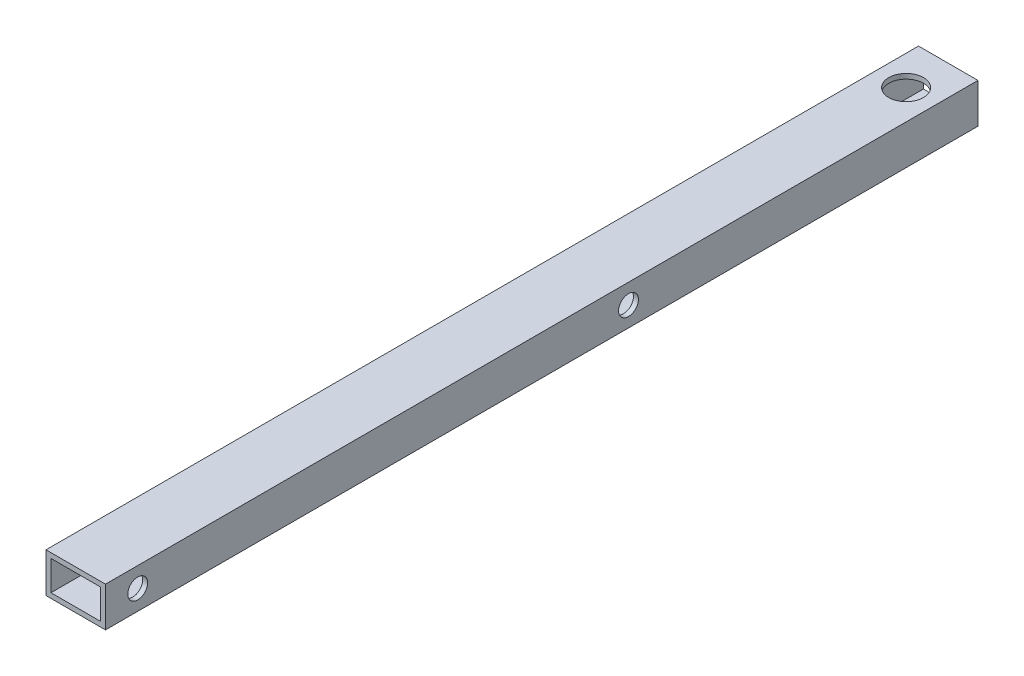
ISO-10303-21;
HEADER;
FILE_DESCRIPTION(('STEP AP214'),'2;1');
FILE_NAME('part.step','',(''),(''),'','','');
FILE_SCHEMA(('AUTOMOTIVE_DESIGN { 1 0 10303 214 1 1 1 1 }'));
ENDSEC;
DATA;
#1=APPLICATION_CONTEXT('core data for automotive mechanical design processes');
#2=APPLICATION_PROTOCOL_DEFINITION('international standard','automotive_design',2000,#1);
#3=PRODUCT_CONTEXT('',#1,'mechanical');
#4=PRODUCT('Part','Part','',(#3));
#5=PRODUCT_RELATED_PRODUCT_CATEGORY('part','',(#4));
#6=PRODUCT_DEFINITION_FORMATION('','',#4);
#7=PRODUCT_DEFINITION_CONTEXT('part definition',#1,'design');
#8=PRODUCT_DEFINITION('design','',#6,#7);
#9=PRODUCT_DEFINITION_SHAPE('','',#8);
#10=(LENGTH_UNIT() NAMED_UNIT(*) SI_UNIT(.MILLI.,.METRE.));
#11=(NAMED_UNIT(*) PLANE_ANGLE_UNIT() SI_UNIT($,.RADIAN.));
#12=(NAMED_UNIT(*) SI_UNIT($,.STERADIAN.) SOLID_ANGLE_UNIT());
#13=UNCERTAINTY_MEASURE_WITH_UNIT(LENGTH_MEASURE(1.E-05),#10,'distance_accuracy_value','');
#14=(GEOMETRIC_REPRESENTATION_CONTEXT(3) GLOBAL_UNCERTAINTY_ASSIGNED_CONTEXT((#13)) GLOBAL_UNIT_ASSIGNED_CONTEXT((#10,
#11,#12)) REPRESENTATION_CONTEXT('',''));
#15=CARTESIAN_POINT('',(0.,0.,0.));
#16=DIRECTION('',(0.,0.,1.));
#17=DIRECTION('',(1.,0.,0.));
#18=AXIS2_PLACEMENT_3D('',#15,#16,#17);
#19=CARTESIAN_POINT('',(0.,0.,558.8));
#20=DIRECTION('',(0.,0.,1.));
#21=DIRECTION('',(1.,0.,0.));
#22=AXIS2_PLACEMENT_3D('',#19,#20,#21);
#23=PLANE('',#22);
#24=DIRECTION('',(0.,1.,0.));
#25=VECTOR('',#24,1.);
#26=CARTESIAN_POINT('',(19.05,12.7,558.8));
#27=LINE('',#26,#25);
#28=CARTESIAN_POINT('',(19.05,-12.7,558.8));
#29=VERTEX_POINT('',#28);
#30=CARTESIAN_POINT('',(19.05,12.7,558.8));
#31=VERTEX_POINT('',#30);
#32=EDGE_CURVE('E136',#29,#31,#27,.T.);
#33=ORIENTED_EDGE('',*,*,#32,.T.);
#34=DIRECTION('',(-1.,0.,0.));
#35=VECTOR('',#34,1.);
#36=CARTESIAN_POINT('',(-19.05,12.7,558.8));
#37=LINE('',#36,#35);
#38=CARTESIAN_POINT('',(-19.05,12.7,558.8));
#39=VERTEX_POINT('',#38);
#40=EDGE_CURVE('E139',#31,#39,#37,.T.);
#41=ORIENTED_EDGE('',*,*,#40,.T.);
#42=DIRECTION('',(0.,-1.,0.));
#43=VECTOR('',#42,1.);
#44=CARTESIAN_POINT('',(-19.05,12.7,558.8));
#45=LINE('',#44,#43);
#46=CARTESIAN_POINT('',(-19.05,-12.7,558.8));
#47=VERTEX_POINT('',#46);
#48=EDGE_CURVE('E142',#39,#47,#45,.T.);
#49=ORIENTED_EDGE('',*,*,#48,.T.);
#50=DIRECTION('',(1.,0.,0.));
#51=VECTOR('',#50,1.);
#52=CARTESIAN_POINT('',(-19.05,-12.7,558.8));
#53=LINE('',#52,#51);
#54=EDGE_CURVE('E144',#47,#29,#53,.T.);
#55=ORIENTED_EDGE('',*,*,#54,.T.);
#56=EDGE_LOOP('',(#33,#41,#49,#55));
#57=FACE_BOUND('',#56,.T.);
#58=DIRECTION('',(-1.,0.,0.));
#59=VECTOR('',#58,1.);
#60=CARTESIAN_POINT('',(-15.875,9.525,558.8));
#61=LINE('',#60,#59);
#62=CARTESIAN_POINT('',(15.875,9.525,558.8));
#63=VERTEX_POINT('',#62);
#64=CARTESIAN_POINT('',(-15.875,9.525,558.8));
#65=VERTEX_POINT('',#64);
#66=EDGE_CURVE('E106',#63,#65,#61,.T.);
#67=ORIENTED_EDGE('',*,*,#66,.F.);
#68=DIRECTION('',(0.,1.,0.));
#69=VECTOR('',#68,1.);
#70=CARTESIAN_POINT('',(15.875,9.525,558.8));
#71=LINE('',#70,#69);
#72=CARTESIAN_POINT('',(15.875,-9.525,558.8));
#73=VERTEX_POINT('',#72);
#74=EDGE_CURVE('E98',#73,#63,#71,.T.);
#75=ORIENTED_EDGE('',*,*,#74,.F.);
#76=DIRECTION('',(1.,0.,0.));
#77=VECTOR('',#76,1.);
#78=CARTESIAN_POINT('',(-15.875,-9.525,558.8));
#79=LINE('',#78,#77);
#80=CARTESIAN_POINT('',(-15.875,-9.525,558.8));
#81=VERTEX_POINT('',#80);
#82=EDGE_CURVE('E120',#81,#73,#79,.T.);
#83=ORIENTED_EDGE('',*,*,#82,.F.);
#84=DIRECTION('',(0.,-1.,0.));
#85=VECTOR('',#84,1.);
#86=CARTESIAN_POINT('',(-15.875,9.525,558.8));
#87=LINE('',#86,#85);
#88=EDGE_CURVE('E118',#65,#81,#87,.T.);
#89=ORIENTED_EDGE('',*,*,#88,.F.);
#90=EDGE_LOOP('',(#67,#75,#83,#89));
#91=FACE_BOUND('',#90,.T.);
#92=ADVANCED_FACE('F32',(#57,#91),#23,.T.);
#93=CARTESIAN_POINT('',(0.,0.,0.));
#94=DIRECTION('',(0.,0.,1.));
#95=DIRECTION('',(1.,0.,0.));
#96=AXIS2_PLACEMENT_3D('',#93,#94,#95);
#97=PLANE('',#96);
#98=DIRECTION('',(0.,1.,0.));
#99=VECTOR('',#98,1.);
#100=CARTESIAN_POINT('',(19.05,12.7,0.));
#101=LINE('',#100,#99);
#102=CARTESIAN_POINT('',(19.05,-12.7,0.));
#103=VERTEX_POINT('',#102);
#104=CARTESIAN_POINT('',(19.05,12.7,0.));
#105=VERTEX_POINT('',#104);
#106=EDGE_CURVE('E114',#103,#105,#101,.T.);
#107=ORIENTED_EDGE('',*,*,#106,.F.);
#108=DIRECTION('',(1.,0.,0.));
#109=VECTOR('',#108,1.);
#110=CARTESIAN_POINT('',(-19.05,-12.7,0.));
#111=LINE('',#110,#109);
#112=CARTESIAN_POINT('',(-19.05,-12.7,0.));
#113=VERTEX_POINT('',#112);
#114=EDGE_CURVE('E140',#113,#103,#111,.T.);
#115=ORIENTED_EDGE('',*,*,#114,.F.);
#116=DIRECTION('',(0.,-1.,0.));
#117=VECTOR('',#116,1.);
#118=CARTESIAN_POINT('',(-19.05,12.7,0.));
#119=LINE('',#118,#117);
#120=CARTESIAN_POINT('',(-19.05,12.7,0.));
#121=VERTEX_POINT('',#120);
#122=EDGE_CURVE('E151',#121,#113,#119,.T.);
#123=ORIENTED_EDGE('',*,*,#122,.F.);
#124=DIRECTION('',(-1.,0.,0.));
#125=VECTOR('',#124,1.);
#126=CARTESIAN_POINT('',(-19.05,12.7,0.));
#127=LINE('',#126,#125);
#128=EDGE_CURVE('E149',#105,#121,#127,.T.);
#129=ORIENTED_EDGE('',*,*,#128,.F.);
#130=EDGE_LOOP('',(#107,#115,#123,#129));
#131=FACE_BOUND('',#130,.T.);
#132=DIRECTION('',(0.,1.,0.));
#133=VECTOR('',#132,1.);
#134=CARTESIAN_POINT('',(15.875,9.525,0.));
#135=LINE('',#134,#133);
#136=CARTESIAN_POINT('',(15.875,-9.525,0.));
#137=VERTEX_POINT('',#136);
#138=CARTESIAN_POINT('',(15.875,9.525,0.));
#139=VERTEX_POINT('',#138);
#140=EDGE_CURVE('E56',#137,#139,#135,.T.);
#141=ORIENTED_EDGE('',*,*,#140,.T.);
#142=DIRECTION('',(-1.,0.,0.));
#143=VECTOR('',#142,1.);
#144=CARTESIAN_POINT('',(-15.875,9.525,0.));
#145=LINE('',#144,#143);
#146=CARTESIAN_POINT('',(-15.875,9.525,0.));
#147=VERTEX_POINT('',#146);
#148=EDGE_CURVE('E113',#139,#147,#145,.T.);
#149=ORIENTED_EDGE('',*,*,#148,.T.);
#150=DIRECTION('',(0.,-1.,0.));
#151=VECTOR('',#150,1.);
#152=CARTESIAN_POINT('',(-15.875,9.525,0.));
#153=LINE('',#152,#151);
#154=CARTESIAN_POINT('',(-15.875,-9.525,0.));
#155=VERTEX_POINT('',#154);
#156=EDGE_CURVE('E128',#147,#155,#153,.T.);
#157=ORIENTED_EDGE('',*,*,#156,.T.);
#158=DIRECTION('',(1.,0.,0.));
#159=VECTOR('',#158,1.);
#160=CARTESIAN_POINT('',(-15.875,-9.525,0.));
#161=LINE('',#160,#159);
#162=EDGE_CURVE('E107',#155,#137,#161,.T.);
#163=ORIENTED_EDGE('',*,*,#162,.T.);
#164=EDGE_LOOP('',(#141,#149,#157,#163));
#165=FACE_BOUND('',#164,.T.);
#166=ADVANCED_FACE('F170',(#131,#165),#97,.F.);
#167=CARTESIAN_POINT('',(19.05,12.7,558.8));
#168=DIRECTION('',(-1.,0.,0.));
#169=DIRECTION('',(0.,0.,1.));
#170=AXIS2_PLACEMENT_3D('',#167,#168,#169);
#171=PLANE('',#170);
#172=CARTESIAN_POINT('',(19.05,0.,223.8375));
#173=DIRECTION('',(1.,0.,0.));
#174=DIRECTION('',(0.,0.,-1.));
#175=AXIS2_PLACEMENT_3D('',#172,#173,#174);
#176=CIRCLE('',#175,6.35);
#177=CARTESIAN_POINT('',(19.05,0.,217.4875));
#178=VERTEX_POINT('',#177);
#179=EDGE_CURVE('E259',#178,#178,#176,.T.);
#180=ORIENTED_EDGE('',*,*,#179,.F.);
#181=EDGE_LOOP('',(#180));
#182=FACE_BOUND('',#181,.T.);
#183=CARTESIAN_POINT('',(19.05,0.,538.1625));
#184=DIRECTION('',(1.,0.,0.));
#185=DIRECTION('',(0.,0.,-1.));
#186=AXIS2_PLACEMENT_3D('',#183,#184,#185);
#187=CIRCLE('',#186,6.34999999999994);
#188=CARTESIAN_POINT('',(19.05,0.,531.8125));
#189=VERTEX_POINT('',#188);
#190=EDGE_CURVE('E263',#189,#189,#187,.T.);
#191=ORIENTED_EDGE('',*,*,#190,.F.);
#192=EDGE_LOOP('',(#191));
#193=FACE_BOUND('',#192,.T.);
#194=ORIENTED_EDGE('',*,*,#106,.T.);
#195=DIRECTION('',(0.,0.,-1.));
#196=VECTOR('',#195,1.);
#197=CARTESIAN_POINT('',(19.05,12.7,558.8));
#198=LINE('',#197,#196);
#199=EDGE_CURVE('E11',#31,#105,#198,.T.);
#200=ORIENTED_EDGE('',*,*,#199,.F.);
#201=ORIENTED_EDGE('',*,*,#32,.F.);
#202=DIRECTION('',(0.,0.,-1.));
#203=VECTOR('',#202,1.);
#204=CARTESIAN_POINT('',(19.05,-12.7,558.8));
#205=LINE('',#204,#203);
#206=EDGE_CURVE('E146',#29,#103,#205,.T.);
#207=ORIENTED_EDGE('',*,*,#206,.T.);
#208=EDGE_LOOP('',(#194,#200,#201,#207));
#209=FACE_BOUND('',#208,.T.);
#210=ADVANCED_FACE('F34',(#182,#193,#209),#171,.F.);
#211=CARTESIAN_POINT('',(-19.05,12.7,558.8));
#212=DIRECTION('',(0.,-1.,0.));
#213=DIRECTION('',(0.,0.,-1.));
#214=AXIS2_PLACEMENT_3D('',#211,#212,#213);
#215=PLANE('',#214);
#216=CARTESIAN_POINT('',(0.,12.7,26.9875));
#217=DIRECTION('',(0.,1.,0.));
#218=DIRECTION('',(0.,0.,1.));
#219=AXIS2_PLACEMENT_3D('',#216,#217,#218);
#220=CIRCLE('',#219,11.1125);
#221=CARTESIAN_POINT('',(0.,12.7,38.1));
#222=VERTEX_POINT('',#221);
#223=EDGE_CURVE('E210',#222,#222,#220,.T.);
#224=ORIENTED_EDGE('',*,*,#223,.F.);
#225=EDGE_LOOP('',(#224));
#226=FACE_BOUND('',#225,.T.);
#227=ORIENTED_EDGE('',*,*,#128,.T.);
#228=DIRECTION('',(0.,0.,-1.));
#229=VECTOR('',#228,1.);
#230=CARTESIAN_POINT('',(-19.05,12.7,558.8));
#231=LINE('',#230,#229);
#232=EDGE_CURVE('E41',#39,#121,#231,.T.);
#233=ORIENTED_EDGE('',*,*,#232,.F.);
#234=ORIENTED_EDGE('',*,*,#40,.F.);
#235=ORIENTED_EDGE('',*,*,#199,.T.);
#236=EDGE_LOOP('',(#227,#233,#234,#235));
#237=FACE_BOUND('',#236,.T.);
#238=ADVANCED_FACE('F180',(#226,#237),#215,.F.);
#239=CARTESIAN_POINT('',(-19.05,12.7,558.8));
#240=DIRECTION('',(1.,0.,0.));
#241=DIRECTION('',(0.,0.,-1.));
#242=AXIS2_PLACEMENT_3D('',#239,#240,#241);
#243=PLANE('',#242);
#244=CARTESIAN_POINT('',(-19.05,0.,223.8375));
#245=DIRECTION('',(-1.,0.,0.));
#246=DIRECTION('',(0.,0.,1.));
#247=AXIS2_PLACEMENT_3D('',#244,#245,#246);
#248=CIRCLE('',#247,3.17499999999997);
#249=CARTESIAN_POINT('',(-19.05,0.,227.0125));
#250=VERTEX_POINT('',#249);
#251=EDGE_CURVE('E272',#250,#250,#248,.T.);
#252=ORIENTED_EDGE('',*,*,#251,.F.);
#253=EDGE_LOOP('',(#252));
#254=FACE_BOUND('',#253,.T.);
#255=CARTESIAN_POINT('',(-19.05,0.,538.1625));
#256=DIRECTION('',(-1.,0.,0.));
#257=DIRECTION('',(0.,0.,1.));
#258=AXIS2_PLACEMENT_3D('',#255,#256,#257);
#259=CIRCLE('',#258,3.17500000000008);
#260=CARTESIAN_POINT('',(-19.05,0.,541.3375));
#261=VERTEX_POINT('',#260);
#262=EDGE_CURVE('E278',#261,#261,#259,.T.);
#263=ORIENTED_EDGE('',*,*,#262,.F.);
#264=EDGE_LOOP('',(#263));
#265=FACE_BOUND('',#264,.T.);
#266=ORIENTED_EDGE('',*,*,#122,.T.);
#267=DIRECTION('',(0.,0.,-1.));
#268=VECTOR('',#267,1.);
#269=CARTESIAN_POINT('',(-19.05,-12.7,558.8));
#270=LINE('',#269,#268);
#271=EDGE_CURVE('E156',#47,#113,#270,.T.);
#272=ORIENTED_EDGE('',*,*,#271,.F.);
#273=ORIENTED_EDGE('',*,*,#48,.F.);
#274=ORIENTED_EDGE('',*,*,#232,.T.);
#275=EDGE_LOOP('',(#266,#272,#273,#274));
#276=FACE_BOUND('',#275,.T.);
#277=ADVANCED_FACE('F164',(#254,#265,#276),#243,.F.);
#278=CARTESIAN_POINT('',(-19.05,-12.7,558.8));
#279=DIRECTION('',(0.,1.,0.));
#280=DIRECTION('',(0.,0.,1.));
#281=AXIS2_PLACEMENT_3D('',#278,#279,#280);
#282=PLANE('',#281);
#283=CARTESIAN_POINT('',(0.,-12.7,26.9875));
#284=DIRECTION('',(0.,1.,0.));
#285=DIRECTION('',(0.,0.,1.));
#286=AXIS2_PLACEMENT_3D('',#283,#284,#285);
#287=CIRCLE('',#286,11.1125);
#288=CARTESIAN_POINT('',(0.,-12.7,38.1));
#289=VERTEX_POINT('',#288);
#290=EDGE_CURVE('E208',#289,#289,#287,.F.);
#291=ORIENTED_EDGE('',*,*,#290,.F.);
#292=EDGE_LOOP('',(#291));
#293=FACE_BOUND('',#292,.T.);
#294=ORIENTED_EDGE('',*,*,#114,.T.);
#295=ORIENTED_EDGE('',*,*,#206,.F.);
#296=ORIENTED_EDGE('',*,*,#54,.F.);
#297=ORIENTED_EDGE('',*,*,#271,.T.);
#298=EDGE_LOOP('',(#294,#295,#296,#297));
#299=FACE_BOUND('',#298,.T.);
#300=ADVANCED_FACE('F174',(#293,#299),#282,.F.);
#301=CARTESIAN_POINT('',(15.875,9.525,558.8));
#302=DIRECTION('',(-1.,0.,0.));
#303=DIRECTION('',(0.,-1.,0.));
#304=AXIS2_PLACEMENT_3D('',#301,#302,#303);
#305=PLANE('',#304);
#306=CARTESIAN_POINT('',(15.875,0.,223.8375));
#307=DIRECTION('',(-1.,0.,0.));
#308=DIRECTION('',(0.,-1.,0.));
#309=AXIS2_PLACEMENT_3D('',#306,#307,#308);
#310=CIRCLE('',#309,6.35);
#311=CARTESIAN_POINT('',(15.875,-6.35,223.8375));
#312=VERTEX_POINT('',#311);
#313=EDGE_CURVE('E262',#312,#312,#310,.F.);
#314=ORIENTED_EDGE('',*,*,#313,.T.);
#315=EDGE_LOOP('',(#314));
#316=FACE_BOUND('',#315,.T.);
#317=CARTESIAN_POINT('',(15.875,0.,538.1625));
#318=DIRECTION('',(-1.,0.,0.));
#319=DIRECTION('',(0.,-1.,0.));
#320=AXIS2_PLACEMENT_3D('',#317,#318,#319);
#321=CIRCLE('',#320,6.34999999999994);
#322=CARTESIAN_POINT('',(15.875,-6.34999999999994,538.1625));
#323=VERTEX_POINT('',#322);
#324=EDGE_CURVE('E266',#323,#323,#321,.F.);
#325=ORIENTED_EDGE('',*,*,#324,.T.);
#326=EDGE_LOOP('',(#325));
#327=FACE_BOUND('',#326,.T.);
#328=ORIENTED_EDGE('',*,*,#140,.F.);
#329=DIRECTION('',(0.,0.,-1.));
#330=VECTOR('',#329,1.);
#331=CARTESIAN_POINT('',(15.875,-9.525,558.8));
#332=LINE('',#331,#330);
#333=EDGE_CURVE('E102',#73,#137,#332,.T.);
#334=ORIENTED_EDGE('',*,*,#333,.F.);
#335=ORIENTED_EDGE('',*,*,#74,.T.);
#336=DIRECTION('',(0.,0.,-1.));
#337=VECTOR('',#336,1.);
#338=CARTESIAN_POINT('',(15.875,9.525,558.8));
#339=LINE('',#338,#337);
#340=EDGE_CURVE('E101',#63,#139,#339,.T.);
#341=ORIENTED_EDGE('',*,*,#340,.T.);
#342=EDGE_LOOP('',(#328,#334,#335,#341));
#343=FACE_BOUND('',#342,.T.);
#344=ADVANCED_FACE('F100',(#316,#327,#343),#305,.T.);
#345=CARTESIAN_POINT('',(-15.875,9.525,558.8));
#346=DIRECTION('',(0.,-1.,0.));
#347=DIRECTION('',(0.,0.,-1.));
#348=AXIS2_PLACEMENT_3D('',#345,#346,#347);
#349=PLANE('',#348);
#350=CARTESIAN_POINT('',(0.,9.525,26.9875));
#351=DIRECTION('',(0.,-1.,0.));
#352=DIRECTION('',(0.,0.,-1.));
#353=AXIS2_PLACEMENT_3D('',#350,#351,#352);
#354=CIRCLE('',#353,11.1125);
#355=CARTESIAN_POINT('',(0.,9.525,15.875));
#356=VERTEX_POINT('',#355);
#357=EDGE_CURVE('E126',#356,#356,#354,.T.);
#358=ORIENTED_EDGE('',*,*,#357,.F.);
#359=EDGE_LOOP('',(#358));
#360=FACE_BOUND('',#359,.T.);
#361=ORIENTED_EDGE('',*,*,#148,.F.);
#362=ORIENTED_EDGE('',*,*,#340,.F.);
#363=ORIENTED_EDGE('',*,*,#66,.T.);
#364=DIRECTION('',(0.,0.,-1.));
#365=VECTOR('',#364,1.);
#366=CARTESIAN_POINT('',(-15.875,9.525,558.8));
#367=LINE('',#366,#365);
#368=EDGE_CURVE('E115',#65,#147,#367,.T.);
#369=ORIENTED_EDGE('',*,*,#368,.T.);
#370=EDGE_LOOP('',(#361,#362,#363,#369));
#371=FACE_BOUND('',#370,.T.);
#372=ADVANCED_FACE('F110',(#360,#371),#349,.T.);
#373=CARTESIAN_POINT('',(-15.875,9.525,558.8));
#374=DIRECTION('',(1.,0.,0.));
#375=DIRECTION('',(0.,1.,0.));
#376=AXIS2_PLACEMENT_3D('',#373,#374,#375);
#377=PLANE('',#376);
#378=CARTESIAN_POINT('',(-15.875,0.,223.8375));
#379=DIRECTION('',(1.,0.,0.));
#380=DIRECTION('',(0.,1.,0.));
#381=AXIS2_PLACEMENT_3D('',#378,#379,#380);
#382=CIRCLE('',#381,3.17499999999997);
#383=CARTESIAN_POINT('',(-15.875,3.17499999999997,223.8375));
#384=VERTEX_POINT('',#383);
#385=EDGE_CURVE('E275',#384,#384,#382,.F.);
#386=ORIENTED_EDGE('',*,*,#385,.T.);
#387=EDGE_LOOP('',(#386));
#388=FACE_BOUND('',#387,.T.);
#389=CARTESIAN_POINT('',(-15.875,0.,538.1625));
#390=DIRECTION('',(1.,0.,0.));
#391=DIRECTION('',(0.,1.,0.));
#392=AXIS2_PLACEMENT_3D('',#389,#390,#391);
#393=CIRCLE('',#392,3.17500000000008);
#394=CARTESIAN_POINT('',(-15.875,3.17500000000008,538.1625));
#395=VERTEX_POINT('',#394);
#396=EDGE_CURVE('E214',#395,#395,#393,.F.);
#397=ORIENTED_EDGE('',*,*,#396,.T.);
#398=EDGE_LOOP('',(#397));
#399=FACE_BOUND('',#398,.T.);
#400=ORIENTED_EDGE('',*,*,#156,.F.);
#401=ORIENTED_EDGE('',*,*,#368,.F.);
#402=ORIENTED_EDGE('',*,*,#88,.T.);
#403=DIRECTION('',(0.,0.,-1.));
#404=VECTOR('',#403,1.);
#405=CARTESIAN_POINT('',(-15.875,-9.525,558.8));
#406=LINE('',#405,#404);
#407=EDGE_CURVE('E48',#81,#155,#406,.T.);
#408=ORIENTED_EDGE('',*,*,#407,.T.);
#409=EDGE_LOOP('',(#400,#401,#402,#408));
#410=FACE_BOUND('',#409,.T.);
#411=ADVANCED_FACE('F224',(#388,#399,#410),#377,.T.);
#412=CARTESIAN_POINT('',(-15.875,-9.525,558.8));
#413=DIRECTION('',(0.,1.,0.));
#414=DIRECTION('',(0.,0.,1.));
#415=AXIS2_PLACEMENT_3D('',#412,#413,#414);
#416=PLANE('',#415);
#417=CARTESIAN_POINT('',(0.,-9.52500000000001,26.9875));
#418=DIRECTION('',(0.,1.,0.));
#419=DIRECTION('',(0.,0.,1.));
#420=AXIS2_PLACEMENT_3D('',#417,#418,#419);
#421=CIRCLE('',#420,11.1125);
#422=CARTESIAN_POINT('',(0.,-9.52500000000001,38.1));
#423=VERTEX_POINT('',#422);
#424=EDGE_CURVE('E36',#423,#423,#421,.T.);
#425=ORIENTED_EDGE('',*,*,#424,.F.);
#426=EDGE_LOOP('',(#425));
#427=FACE_BOUND('',#426,.T.);
#428=ORIENTED_EDGE('',*,*,#162,.F.);
#429=ORIENTED_EDGE('',*,*,#407,.F.);
#430=ORIENTED_EDGE('',*,*,#82,.T.);
#431=ORIENTED_EDGE('',*,*,#333,.T.);
#432=EDGE_LOOP('',(#428,#429,#430,#431));
#433=FACE_BOUND('',#432,.T.);
#434=ADVANCED_FACE('F228',(#427,#433),#416,.T.);
#435=CARTESIAN_POINT('',(0.,-44.130896423742,26.9875));
#436=DIRECTION('',(0.,1.,0.));
#437=DIRECTION('',(0.,0.,1.));
#438=AXIS2_PLACEMENT_3D('',#435,#436,#437);
#439=CYLINDRICAL_SURFACE('',#438,11.1125);
#440=ORIENTED_EDGE('',*,*,#424,.T.);
#441=EDGE_LOOP('',(#440));
#442=FACE_BOUND('',#441,.T.);
#443=ORIENTED_EDGE('',*,*,#290,.T.);
#444=EDGE_LOOP('',(#443));
#445=FACE_BOUND('',#444,.T.);
#446=ADVANCED_FACE('F234',(#442,#445),#439,.F.);
#447=ORIENTED_EDGE('',*,*,#357,.T.);
#448=EDGE_LOOP('',(#447));
#449=FACE_BOUND('',#448,.T.);
#450=ORIENTED_EDGE('',*,*,#223,.T.);
#451=EDGE_LOOP('',(#450));
#452=FACE_BOUND('',#451,.T.);
#453=ADVANCED_FACE('F220',(#449,#452),#439,.F.);
#454=CARTESIAN_POINT('',(-6.89474387893068,0.,538.1625));
#455=DIRECTION('',(-1.,0.,0.));
#456=DIRECTION('',(0.,0.,1.));
#457=AXIS2_PLACEMENT_3D('',#454,#455,#456);
#458=CYLINDRICAL_SURFACE('',#457,3.17500000000008);
#459=ORIENTED_EDGE('',*,*,#262,.T.);
#460=EDGE_LOOP('',(#459));
#461=FACE_BOUND('',#460,.T.);
#462=ORIENTED_EDGE('',*,*,#396,.F.);
#463=EDGE_LOOP('',(#462));
#464=FACE_BOUND('',#463,.T.);
#465=ADVANCED_FACE('F239',(#461,#464),#458,.F.);
#466=CARTESIAN_POINT('',(-6.89474387893068,0.,223.8375));
#467=DIRECTION('',(-1.,0.,0.));
#468=DIRECTION('',(0.,0.,1.));
#469=AXIS2_PLACEMENT_3D('',#466,#467,#468);
#470=CYLINDRICAL_SURFACE('',#469,3.17499999999997);
#471=ORIENTED_EDGE('',*,*,#251,.T.);
#472=EDGE_LOOP('',(#471));
#473=FACE_BOUND('',#472,.T.);
#474=ORIENTED_EDGE('',*,*,#385,.F.);
#475=EDGE_LOOP('',(#474));
#476=FACE_BOUND('',#475,.T.);
#477=ADVANCED_FACE('F242',(#473,#476),#470,.F.);
#478=CARTESIAN_POINT('',(-2.08551224213829,0.,538.1625));
#479=DIRECTION('',(1.,0.,0.));
#480=DIRECTION('',(0.,0.,-1.));
#481=AXIS2_PLACEMENT_3D('',#478,#479,#480);
#482=CYLINDRICAL_SURFACE('',#481,6.34999999999994);
#483=ORIENTED_EDGE('',*,*,#190,.T.);
#484=EDGE_LOOP('',(#483));
#485=FACE_BOUND('',#484,.T.);
#486=ORIENTED_EDGE('',*,*,#324,.F.);
#487=EDGE_LOOP('',(#486));
#488=FACE_BOUND('',#487,.T.);
#489=ADVANCED_FACE('F246',(#485,#488),#482,.F.);
#490=CARTESIAN_POINT('',(-2.08551224213829,0.,223.8375));
#491=DIRECTION('',(1.,0.,0.));
#492=DIRECTION('',(0.,0.,-1.));
#493=AXIS2_PLACEMENT_3D('',#490,#491,#492);
#494=CYLINDRICAL_SURFACE('',#493,6.35);
#495=ORIENTED_EDGE('',*,*,#179,.T.);
#496=EDGE_LOOP('',(#495));
#497=FACE_BOUND('',#496,.T.);
#498=ORIENTED_EDGE('',*,*,#313,.F.);
#499=EDGE_LOOP('',(#498));
#500=FACE_BOUND('',#499,.T.);
#501=ADVANCED_FACE('F250',(#497,#500),#494,.F.);
#502=CLOSED_SHELL('',(#92,#166,#210,#238,#277,#300,#344,#372,#411,#434,#446,#453,#465,#477,#489,#501));
#503=MANIFOLD_SOLID_BREP('B2',#502);
#504=ADVANCED_BREP_SHAPE_REPRESENTATION('',(#18,#503),#14);
#505=SHAPE_DEFINITION_REPRESENTATION(#9,#504);
ENDSEC;
END-ISO-10303-21;
